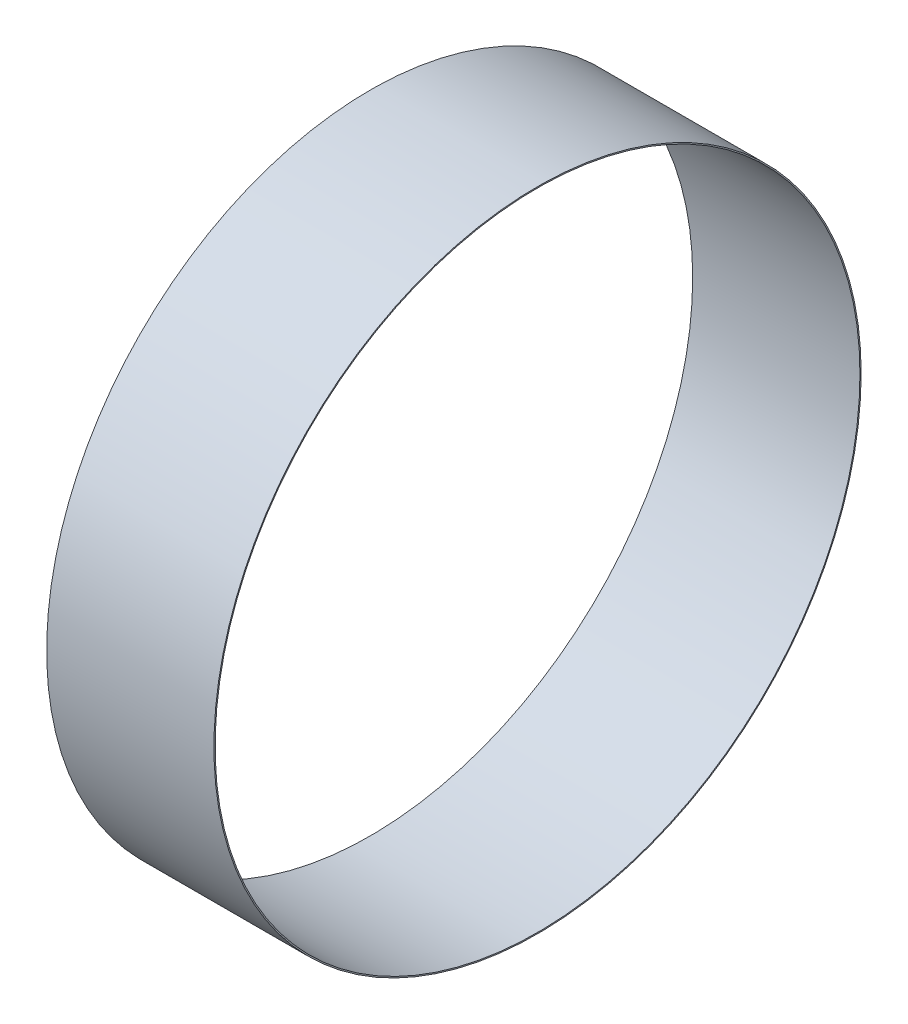
ISO-10303-21;
HEADER;
FILE_DESCRIPTION(('STEP AP214'),'2;1');
FILE_NAME('part.step','',(''),(''),'','','');
FILE_SCHEMA(('AUTOMOTIVE_DESIGN { 1 0 10303 214 1 1 1 1 }'));
ENDSEC;
DATA;
#1=APPLICATION_CONTEXT('core data for automotive mechanical design processes');
#2=APPLICATION_PROTOCOL_DEFINITION('international standard','automotive_design',2000,#1);
#3=PRODUCT_CONTEXT('',#1,'mechanical');
#4=PRODUCT('Part','Part','',(#3));
#5=PRODUCT_RELATED_PRODUCT_CATEGORY('part','',(#4));
#6=PRODUCT_DEFINITION_FORMATION('','',#4);
#7=PRODUCT_DEFINITION_CONTEXT('part definition',#1,'design');
#8=PRODUCT_DEFINITION('design','',#6,#7);
#9=PRODUCT_DEFINITION_SHAPE('','',#8);
#10=(LENGTH_UNIT() NAMED_UNIT(*) SI_UNIT(.MILLI.,.METRE.));
#11=(NAMED_UNIT(*) PLANE_ANGLE_UNIT() SI_UNIT($,.RADIAN.));
#12=(NAMED_UNIT(*) SI_UNIT($,.STERADIAN.) SOLID_ANGLE_UNIT());
#13=UNCERTAINTY_MEASURE_WITH_UNIT(LENGTH_MEASURE(1.E-05),#10,'distance_accuracy_value','');
#14=(GEOMETRIC_REPRESENTATION_CONTEXT(3) GLOBAL_UNCERTAINTY_ASSIGNED_CONTEXT((#13)) GLOBAL_UNIT_ASSIGNED_CONTEXT((#10,
#11,#12)) REPRESENTATION_CONTEXT('',''));
#15=CARTESIAN_POINT('',(0.,0.,0.));
#16=DIRECTION('',(0.,0.,1.));
#17=DIRECTION('',(1.,0.,0.));
#18=AXIS2_PLACEMENT_3D('',#15,#16,#17);
#19=CARTESIAN_POINT('',(415.,0.,0.));
#20=DIRECTION('',(1.,0.,0.));
#21=DIRECTION('',(0.,0.,-1.));
#22=AXIS2_PLACEMENT_3D('',#19,#20,#21);
#23=PLANE('',#22);
#24=CARTESIAN_POINT('',(415.,0.,0.));
#25=DIRECTION('',(1.,0.,0.));
#26=DIRECTION('',(0.,0.,-1.));
#27=AXIS2_PLACEMENT_3D('',#24,#25,#26);
#28=CIRCLE('',#27,803.);
#29=CARTESIAN_POINT('',(415.,0.,-803.));
#30=VERTEX_POINT('',#29);
#31=EDGE_CURVE('E10',#30,#30,#28,.T.);
#32=ORIENTED_EDGE('',*,*,#31,.T.);
#33=EDGE_LOOP('',(#32));
#34=FACE_BOUND('',#33,.T.);
#35=CARTESIAN_POINT('',(415.,0.,0.));
#36=DIRECTION('',(1.,0.,0.));
#37=DIRECTION('',(0.,0.,-1.));
#38=AXIS2_PLACEMENT_3D('',#35,#36,#37);
#39=CIRCLE('',#38,800.);
#40=CARTESIAN_POINT('',(415.,0.,-800.));
#41=VERTEX_POINT('',#40);
#42=EDGE_CURVE('E42',#41,#41,#39,.T.);
#43=ORIENTED_EDGE('',*,*,#42,.F.);
#44=EDGE_LOOP('',(#43));
#45=FACE_BOUND('',#44,.T.);
#46=ADVANCED_FACE('F31',(#34,#45),#23,.T.);
#47=CARTESIAN_POINT('',(0.,0.,0.));
#48=DIRECTION('',(1.,0.,0.));
#49=DIRECTION('',(0.,0.,-1.));
#50=AXIS2_PLACEMENT_3D('',#47,#48,#49);
#51=PLANE('',#50);
#52=CARTESIAN_POINT('',(0.,0.,0.));
#53=DIRECTION('',(1.,0.,0.));
#54=DIRECTION('',(0.,0.,-1.));
#55=AXIS2_PLACEMENT_3D('',#52,#53,#54);
#56=CIRCLE('',#55,803.);
#57=CARTESIAN_POINT('',(0.,0.,-803.));
#58=VERTEX_POINT('',#57);
#59=EDGE_CURVE('E35',#58,#58,#56,.T.);
#60=ORIENTED_EDGE('',*,*,#59,.F.);
#61=EDGE_LOOP('',(#60));
#62=FACE_BOUND('',#61,.T.);
#63=CARTESIAN_POINT('',(0.,0.,0.));
#64=DIRECTION('',(1.,0.,0.));
#65=DIRECTION('',(0.,0.,-1.));
#66=AXIS2_PLACEMENT_3D('',#63,#64,#65);
#67=CIRCLE('',#66,800.);
#68=CARTESIAN_POINT('',(0.,0.,-800.));
#69=VERTEX_POINT('',#68);
#70=EDGE_CURVE('E44',#69,#69,#67,.T.);
#71=ORIENTED_EDGE('',*,*,#70,.T.);
#72=EDGE_LOOP('',(#71));
#73=FACE_BOUND('',#72,.T.);
#74=ADVANCED_FACE('F54',(#62,#73),#51,.F.);
#75=CARTESIAN_POINT('',(415.,0.,0.));
#76=DIRECTION('',(-1.,0.,0.));
#77=DIRECTION('',(0.,0.,1.));
#78=AXIS2_PLACEMENT_3D('',#75,#76,#77);
#79=CYLINDRICAL_SURFACE('',#78,803.);
#80=ORIENTED_EDGE('',*,*,#31,.F.);
#81=EDGE_LOOP('',(#80));
#82=FACE_BOUND('',#81,.T.);
#83=ORIENTED_EDGE('',*,*,#59,.T.);
#84=EDGE_LOOP('',(#83));
#85=FACE_BOUND('',#84,.T.);
#86=ADVANCED_FACE('F33',(#82,#85),#79,.T.);
#87=CARTESIAN_POINT('',(415.,0.,0.));
#88=DIRECTION('',(-1.,0.,0.));
#89=DIRECTION('',(0.,0.,1.));
#90=AXIS2_PLACEMENT_3D('',#87,#88,#89);
#91=CYLINDRICAL_SURFACE('',#90,800.);
#92=ORIENTED_EDGE('',*,*,#42,.T.);
#93=EDGE_LOOP('',(#92));
#94=FACE_BOUND('',#93,.T.);
#95=ORIENTED_EDGE('',*,*,#70,.F.);
#96=EDGE_LOOP('',(#95));
#97=FACE_BOUND('',#96,.T.);
#98=ADVANCED_FACE('F50',(#94,#97),#91,.F.);
#99=CLOSED_SHELL('',(#46,#74,#86,#98));
#100=MANIFOLD_SOLID_BREP('B2',#99);
#101=ADVANCED_BREP_SHAPE_REPRESENTATION('',(#18,#100),#14);
#102=SHAPE_DEFINITION_REPRESENTATION(#9,#101);
ENDSEC;
END-ISO-10303-21;
